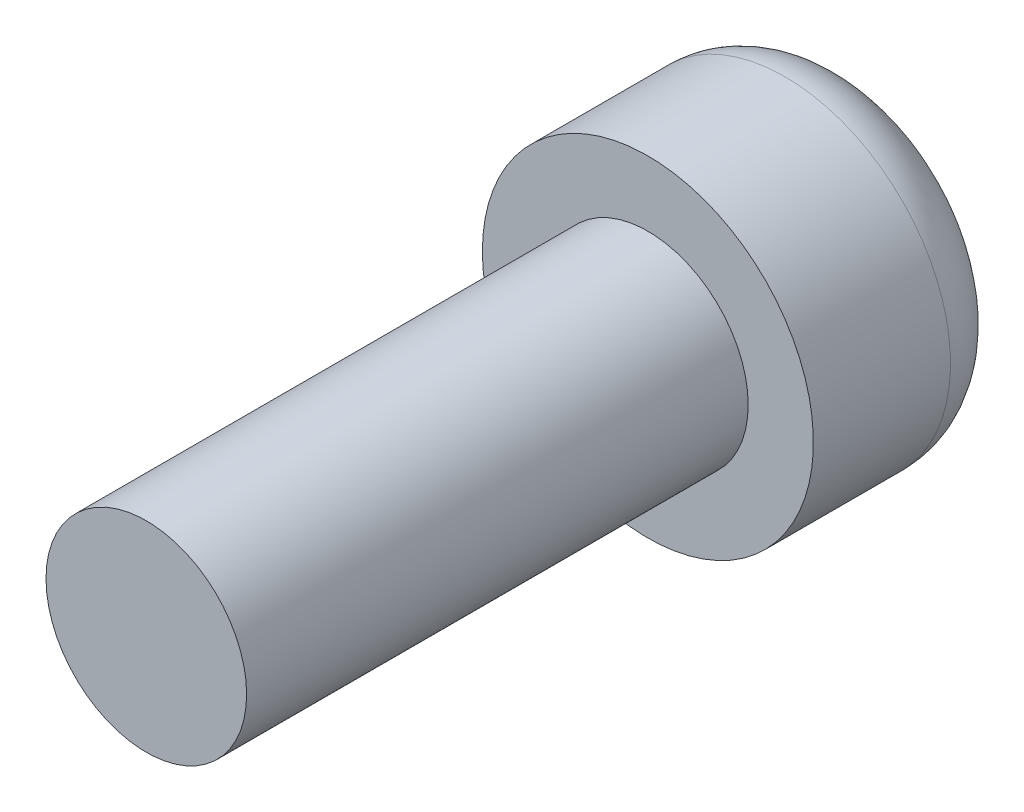
ISO-10303-21;
HEADER;
FILE_DESCRIPTION(('STEP AP214'),'2;1');
FILE_NAME('part.step','',(''),(''),'','','');
FILE_SCHEMA(('AUTOMOTIVE_DESIGN { 1 0 10303 214 1 1 1 1 }'));
ENDSEC;
DATA;
#1=APPLICATION_CONTEXT('core data for automotive mechanical design processes');
#2=APPLICATION_PROTOCOL_DEFINITION('international standard','automotive_design',2000,#1);
#3=PRODUCT_CONTEXT('',#1,'mechanical');
#4=PRODUCT('Part','Part','',(#3));
#5=PRODUCT_RELATED_PRODUCT_CATEGORY('part','',(#4));
#6=PRODUCT_DEFINITION_FORMATION('','',#4);
#7=PRODUCT_DEFINITION_CONTEXT('part definition',#1,'design');
#8=PRODUCT_DEFINITION('design','',#6,#7);
#9=PRODUCT_DEFINITION_SHAPE('','',#8);
#10=(LENGTH_UNIT() NAMED_UNIT(*) SI_UNIT(.MILLI.,.METRE.));
#11=(NAMED_UNIT(*) PLANE_ANGLE_UNIT() SI_UNIT($,.RADIAN.));
#12=(NAMED_UNIT(*) SI_UNIT($,.STERADIAN.) SOLID_ANGLE_UNIT());
#13=UNCERTAINTY_MEASURE_WITH_UNIT(LENGTH_MEASURE(1.E-05),#10,'distance_accuracy_value','');
#14=(GEOMETRIC_REPRESENTATION_CONTEXT(3) GLOBAL_UNCERTAINTY_ASSIGNED_CONTEXT((#13)) GLOBAL_UNIT_ASSIGNED_CONTEXT((#10,
#11,#12)) REPRESENTATION_CONTEXT('',''));
#15=CARTESIAN_POINT('',(0.,0.,0.));
#16=DIRECTION('',(0.,0.,1.));
#17=DIRECTION('',(1.,0.,0.));
#18=AXIS2_PLACEMENT_3D('',#15,#16,#17);
#19=CARTESIAN_POINT('',(0.,0.,15.));
#20=DIRECTION('',(0.,0.,-1.));
#21=DIRECTION('',(-1.,0.,0.));
#22=AXIS2_PLACEMENT_3D('',#19,#20,#21);
#23=CYLINDRICAL_SURFACE('',#22,3.);
#24=CARTESIAN_POINT('',(0.,0.,15.));
#25=DIRECTION('',(0.,0.,1.));
#26=DIRECTION('',(1.,0.,0.));
#27=AXIS2_PLACEMENT_3D('',#24,#25,#26);
#28=CIRCLE('',#27,3.);
#29=CARTESIAN_POINT('',(3.,0.,15.));
#30=VERTEX_POINT('',#29);
#31=EDGE_CURVE('E50',#30,#30,#28,.T.);
#32=ORIENTED_EDGE('',*,*,#31,.F.);
#33=EDGE_LOOP('',(#32));
#34=FACE_BOUND('',#33,.T.);
#35=CARTESIAN_POINT('',(0.,0.,0.));
#36=DIRECTION('',(0.,0.,1.));
#37=DIRECTION('',(1.,0.,0.));
#38=AXIS2_PLACEMENT_3D('',#35,#36,#37);
#39=CIRCLE('',#38,3.);
#40=CARTESIAN_POINT('',(3.,0.,0.));
#41=VERTEX_POINT('',#40);
#42=EDGE_CURVE('E55',#41,#41,#39,.T.);
#43=ORIENTED_EDGE('',*,*,#42,.T.);
#44=EDGE_LOOP('',(#43));
#45=FACE_BOUND('',#44,.T.);
#46=ADVANCED_FACE('F37',(#34,#45),#23,.T.);
#47=CARTESIAN_POINT('',(0.,0.,15.));
#48=DIRECTION('',(0.,0.,1.));
#49=DIRECTION('',(1.,0.,0.));
#50=AXIS2_PLACEMENT_3D('',#47,#48,#49);
#51=PLANE('',#50);
#52=ORIENTED_EDGE('',*,*,#31,.T.);
#53=EDGE_LOOP('',(#52));
#54=FACE_BOUND('',#53,.T.);
#55=ADVANCED_FACE('F82',(#54),#51,.T.);
#56=CARTESIAN_POINT('',(0.,0.,-6.1));
#57=DIRECTION('',(0.,0.,1.));
#58=DIRECTION('',(1.,0.,0.));
#59=AXIS2_PLACEMENT_3D('',#56,#57,#58);
#60=CYLINDRICAL_SURFACE('',#59,4.95);
#61=CARTESIAN_POINT('',(0.,0.,-4.1));
#62=DIRECTION('',(0.,0.,-1.));
#63=DIRECTION('',(-1.,0.,0.));
#64=AXIS2_PLACEMENT_3D('',#61,#62,#63);
#65=CIRCLE('',#64,4.95);
#66=CARTESIAN_POINT('',(-4.95,0.,-4.1));
#67=VERTEX_POINT('',#66);
#68=EDGE_CURVE('E10',#67,#67,#65,.F.);
#69=ORIENTED_EDGE('',*,*,#68,.T.);
#70=EDGE_LOOP('',(#69));
#71=FACE_BOUND('',#70,.T.);
#72=CARTESIAN_POINT('',(0.,0.,0.));
#73=DIRECTION('',(0.,0.,-1.));
#74=DIRECTION('',(-1.,0.,0.));
#75=AXIS2_PLACEMENT_3D('',#72,#73,#74);
#76=CIRCLE('',#75,4.95);
#77=CARTESIAN_POINT('',(-4.95,0.,0.));
#78=VERTEX_POINT('',#77);
#79=EDGE_CURVE('E60',#78,#78,#76,.T.);
#80=ORIENTED_EDGE('',*,*,#79,.T.);
#81=EDGE_LOOP('',(#80));
#82=FACE_BOUND('',#81,.T.);
#83=ADVANCED_FACE('F66',(#71,#82),#60,.T.);
#84=CARTESIAN_POINT('',(0.,0.,-6.1));
#85=DIRECTION('',(0.,0.,-1.));
#86=DIRECTION('',(-1.,0.,0.));
#87=AXIS2_PLACEMENT_3D('',#84,#85,#86);
#88=PLANE('',#87);
#89=CARTESIAN_POINT('',(0.,0.,-6.1));
#90=DIRECTION('',(0.,0.,-1.));
#91=DIRECTION('',(-1.,0.,0.));
#92=AXIS2_PLACEMENT_3D('',#89,#90,#91);
#93=CIRCLE('',#92,2.95);
#94=CARTESIAN_POINT('',(-2.95,0.,-6.1));
#95=VERTEX_POINT('',#94);
#96=EDGE_CURVE('E45',#95,#95,#93,.T.);
#97=ORIENTED_EDGE('',*,*,#96,.T.);
#98=EDGE_LOOP('',(#97));
#99=FACE_BOUND('',#98,.T.);
#100=ADVANCED_FACE('F70',(#99),#88,.T.);
#101=CARTESIAN_POINT('',(0.,0.,0.));
#102=DIRECTION('',(0.,0.,-1.));
#103=DIRECTION('',(-1.,0.,0.));
#104=AXIS2_PLACEMENT_3D('',#101,#102,#103);
#105=PLANE('',#104);
#106=ORIENTED_EDGE('',*,*,#42,.F.);
#107=EDGE_LOOP('',(#106));
#108=FACE_BOUND('',#107,.T.);
#109=ORIENTED_EDGE('',*,*,#79,.F.);
#110=EDGE_LOOP('',(#109));
#111=FACE_BOUND('',#110,.T.);
#112=ADVANCED_FACE('F68',(#108,#111),#105,.F.);
#113=CARTESIAN_POINT('',(0.,0.,-4.1));
#114=DIRECTION('',(0.,0.,-1.));
#115=DIRECTION('',(-1.,0.,0.));
#116=AXIS2_PLACEMENT_3D('',#113,#114,#115);
#117=TOROIDAL_SURFACE('',#116,2.95,2.);
#118=ORIENTED_EDGE('',*,*,#68,.F.);
#119=EDGE_LOOP('',(#118));
#120=FACE_BOUND('',#119,.T.);
#121=ORIENTED_EDGE('',*,*,#96,.F.);
#122=EDGE_LOOP('',(#121));
#123=FACE_BOUND('',#122,.T.);
#124=ADVANCED_FACE('F39',(#120,#123),#117,.T.);
#125=CLOSED_SHELL('',(#46,#55,#83,#100,#112,#124));
#126=MANIFOLD_SOLID_BREP('B2',#125);
#127=ADVANCED_BREP_SHAPE_REPRESENTATION('',(#18,#126),#14);
#128=SHAPE_DEFINITION_REPRESENTATION(#9,#127);
ENDSEC;
END-ISO-10303-21;
